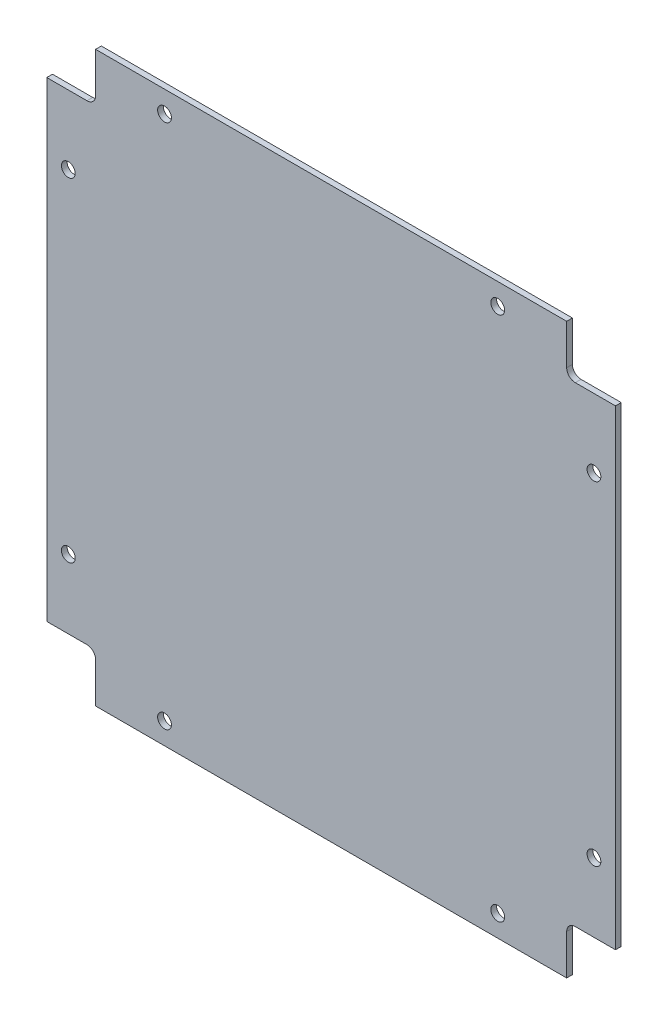
ISO-10303-21;
HEADER;
FILE_DESCRIPTION(('STEP AP214'),'2;1');
FILE_NAME('part.step','',(''),(''),'','','');
FILE_SCHEMA(('AUTOMOTIVE_DESIGN { 1 0 10303 214 1 1 1 1 }'));
ENDSEC;
DATA;
#1=APPLICATION_CONTEXT('core data for automotive mechanical design processes');
#2=APPLICATION_PROTOCOL_DEFINITION('international standard','automotive_design',2000,#1);
#3=PRODUCT_CONTEXT('',#1,'mechanical');
#4=PRODUCT('Part','Part','',(#3));
#5=PRODUCT_RELATED_PRODUCT_CATEGORY('part','',(#4));
#6=PRODUCT_DEFINITION_FORMATION('','',#4);
#7=PRODUCT_DEFINITION_CONTEXT('part definition',#1,'design');
#8=PRODUCT_DEFINITION('design','',#6,#7);
#9=PRODUCT_DEFINITION_SHAPE('','',#8);
#10=(LENGTH_UNIT() NAMED_UNIT(*) SI_UNIT(.MILLI.,.METRE.));
#11=(NAMED_UNIT(*) PLANE_ANGLE_UNIT() SI_UNIT($,.RADIAN.));
#12=(NAMED_UNIT(*) SI_UNIT($,.STERADIAN.) SOLID_ANGLE_UNIT());
#13=UNCERTAINTY_MEASURE_WITH_UNIT(LENGTH_MEASURE(1.E-05),#10,'distance_accuracy_value','');
#14=(GEOMETRIC_REPRESENTATION_CONTEXT(3) GLOBAL_UNCERTAINTY_ASSIGNED_CONTEXT((#13)) GLOBAL_UNIT_ASSIGNED_CONTEXT((#10,
#11,#12)) REPRESENTATION_CONTEXT('',''));
#15=CARTESIAN_POINT('',(0.,0.,0.));
#16=DIRECTION('',(0.,0.,1.));
#17=DIRECTION('',(1.,0.,0.));
#18=AXIS2_PLACEMENT_3D('',#15,#16,#17);
#19=CARTESIAN_POINT('',(49.5,-49.5,0.5));
#20=DIRECTION('',(-1.,0.,0.));
#21=DIRECTION('',(0.,0.,1.));
#22=AXIS2_PLACEMENT_3D('',#19,#20,#21);
#23=PLANE('',#22);
#24=DIRECTION('',(0.,1.,0.));
#25=VECTOR('',#24,1.);
#26=CARTESIAN_POINT('',(49.5,-49.5,0.5));
#27=LINE('',#26,#25);
#28=CARTESIAN_POINT('',(49.5,-41.,0.5));
#29=VERTEX_POINT('',#28);
#30=CARTESIAN_POINT('',(49.5,41.,0.5));
#31=VERTEX_POINT('',#30);
#32=EDGE_CURVE('E165',#29,#31,#27,.T.);
#33=ORIENTED_EDGE('',*,*,#32,.F.);
#34=DIRECTION('',(0.,0.,1.));
#35=VECTOR('',#34,1.);
#36=CARTESIAN_POINT('',(49.5,-41.,-0.5));
#37=LINE('',#36,#35);
#38=CARTESIAN_POINT('',(49.5,-41.,-0.5));
#39=VERTEX_POINT('',#38);
#40=EDGE_CURVE('E256',#39,#29,#37,.T.);
#41=ORIENTED_EDGE('',*,*,#40,.F.);
#42=DIRECTION('',(0.,1.,0.));
#43=VECTOR('',#42,1.);
#44=CARTESIAN_POINT('',(49.5,-49.5,-0.5));
#45=LINE('',#44,#43);
#46=CARTESIAN_POINT('',(49.5,41.,-0.5));
#47=VERTEX_POINT('',#46);
#48=EDGE_CURVE('E309',#39,#47,#45,.T.);
#49=ORIENTED_EDGE('',*,*,#48,.T.);
#50=DIRECTION('',(0.,0.,1.));
#51=VECTOR('',#50,1.);
#52=CARTESIAN_POINT('',(49.5,41.,-0.5));
#53=LINE('',#52,#51);
#54=EDGE_CURVE('E284',#47,#31,#53,.T.);
#55=ORIENTED_EDGE('',*,*,#54,.T.);
#56=EDGE_LOOP('',(#33,#41,#49,#55));
#57=FACE_BOUND('',#56,.T.);
#58=ADVANCED_FACE('F32',(#57),#23,.F.);
#59=CARTESIAN_POINT('',(-49.5,49.5,0.5));
#60=DIRECTION('',(0.,-1.,0.));
#61=DIRECTION('',(0.,0.,-1.));
#62=AXIS2_PLACEMENT_3D('',#59,#60,#61);
#63=PLANE('',#62);
#64=DIRECTION('',(-1.,0.,0.));
#65=VECTOR('',#64,1.);
#66=CARTESIAN_POINT('',(-49.5,49.5,0.5));
#67=LINE('',#66,#65);
#68=CARTESIAN_POINT('',(41.,49.5,0.5));
#69=VERTEX_POINT('',#68);
#70=CARTESIAN_POINT('',(-41.,49.5,0.5));
#71=VERTEX_POINT('',#70);
#72=EDGE_CURVE('E168',#69,#71,#67,.T.);
#73=ORIENTED_EDGE('',*,*,#72,.F.);
#74=DIRECTION('',(0.,0.,1.));
#75=VECTOR('',#74,1.);
#76=CARTESIAN_POINT('',(41.,49.5,-0.5));
#77=LINE('',#76,#75);
#78=CARTESIAN_POINT('',(41.,49.5,-0.5));
#79=VERTEX_POINT('',#78);
#80=EDGE_CURVE('E282',#79,#69,#77,.T.);
#81=ORIENTED_EDGE('',*,*,#80,.F.);
#82=DIRECTION('',(-1.,0.,0.));
#83=VECTOR('',#82,1.);
#84=CARTESIAN_POINT('',(-49.5,49.5,-0.5));
#85=LINE('',#84,#83);
#86=CARTESIAN_POINT('',(-41.,49.5,-0.5));
#87=VERTEX_POINT('',#86);
#88=EDGE_CURVE('E171',#79,#87,#85,.T.);
#89=ORIENTED_EDGE('',*,*,#88,.T.);
#90=DIRECTION('',(0.,0.,1.));
#91=VECTOR('',#90,1.);
#92=CARTESIAN_POINT('',(-41.,49.5,-0.5));
#93=LINE('',#92,#91);
#94=EDGE_CURVE('E306',#87,#71,#93,.T.);
#95=ORIENTED_EDGE('',*,*,#94,.T.);
#96=EDGE_LOOP('',(#73,#81,#89,#95));
#97=FACE_BOUND('',#96,.T.);
#98=ADVANCED_FACE('F323',(#97),#63,.F.);
#99=CARTESIAN_POINT('',(-49.5,-49.5,0.5));
#100=DIRECTION('',(1.,0.,0.));
#101=DIRECTION('',(0.,0.,-1.));
#102=AXIS2_PLACEMENT_3D('',#99,#100,#101);
#103=PLANE('',#102);
#104=DIRECTION('',(0.,-1.,0.));
#105=VECTOR('',#104,1.);
#106=CARTESIAN_POINT('',(-49.5,-49.5,-0.5));
#107=LINE('',#106,#105);
#108=CARTESIAN_POINT('',(-49.5,41.,-0.5));
#109=VERTEX_POINT('',#108);
#110=CARTESIAN_POINT('',(-49.5,-41.,-0.5));
#111=VERTEX_POINT('',#110);
#112=EDGE_CURVE('E166',#109,#111,#107,.T.);
#113=ORIENTED_EDGE('',*,*,#112,.T.);
#114=DIRECTION('',(0.,0.,1.));
#115=VECTOR('',#114,1.);
#116=CARTESIAN_POINT('',(-49.5,-41.,-0.5));
#117=LINE('',#116,#115);
#118=CARTESIAN_POINT('',(-49.5,-41.,0.5));
#119=VERTEX_POINT('',#118);
#120=EDGE_CURVE('E231',#111,#119,#117,.T.);
#121=ORIENTED_EDGE('',*,*,#120,.T.);
#122=DIRECTION('',(0.,-1.,0.));
#123=VECTOR('',#122,1.);
#124=CARTESIAN_POINT('',(-49.5,-49.5,0.5));
#125=LINE('',#124,#123);
#126=CARTESIAN_POINT('',(-49.5,41.,0.5));
#127=VERTEX_POINT('',#126);
#128=EDGE_CURVE('E40',#127,#119,#125,.T.);
#129=ORIENTED_EDGE('',*,*,#128,.F.);
#130=DIRECTION('',(0.,0.,1.));
#131=VECTOR('',#130,1.);
#132=CARTESIAN_POINT('',(-49.5,41.,-0.5));
#133=LINE('',#132,#131);
#134=EDGE_CURVE('E298',#109,#127,#133,.T.);
#135=ORIENTED_EDGE('',*,*,#134,.F.);
#136=EDGE_LOOP('',(#113,#121,#129,#135));
#137=FACE_BOUND('',#136,.T.);
#138=ADVANCED_FACE('F373',(#137),#103,.F.);
#139=CARTESIAN_POINT('',(-49.5,-49.5,0.5));
#140=DIRECTION('',(0.,1.,0.));
#141=DIRECTION('',(0.,0.,1.));
#142=AXIS2_PLACEMENT_3D('',#139,#140,#141);
#143=PLANE('',#142);
#144=DIRECTION('',(1.,0.,0.));
#145=VECTOR('',#144,1.);
#146=CARTESIAN_POINT('',(-49.5,-49.5,0.5));
#147=LINE('',#146,#145);
#148=CARTESIAN_POINT('',(-41.,-49.5,0.5));
#149=VERTEX_POINT('',#148);
#150=CARTESIAN_POINT('',(41.,-49.5,0.5));
#151=VERTEX_POINT('',#150);
#152=EDGE_CURVE('E11',#149,#151,#147,.T.);
#153=ORIENTED_EDGE('',*,*,#152,.F.);
#154=DIRECTION('',(0.,0.,1.));
#155=VECTOR('',#154,1.);
#156=CARTESIAN_POINT('',(-41.,-49.5,-0.5));
#157=LINE('',#156,#155);
#158=CARTESIAN_POINT('',(-41.,-49.5,-0.5));
#159=VERTEX_POINT('',#158);
#160=EDGE_CURVE('E149',#159,#149,#157,.T.);
#161=ORIENTED_EDGE('',*,*,#160,.F.);
#162=DIRECTION('',(1.,0.,0.));
#163=VECTOR('',#162,1.);
#164=CARTESIAN_POINT('',(-49.5,-49.5,-0.5));
#165=LINE('',#164,#163);
#166=CARTESIAN_POINT('',(41.,-49.5,-0.5));
#167=VERTEX_POINT('',#166);
#168=EDGE_CURVE('E56',#159,#167,#165,.T.);
#169=ORIENTED_EDGE('',*,*,#168,.T.);
#170=DIRECTION('',(0.,0.,1.));
#171=VECTOR('',#170,1.);
#172=CARTESIAN_POINT('',(41.,-49.5,-0.5));
#173=LINE('',#172,#171);
#174=EDGE_CURVE('E258',#167,#151,#173,.T.);
#175=ORIENTED_EDGE('',*,*,#174,.T.);
#176=EDGE_LOOP('',(#153,#161,#169,#175));
#177=FACE_BOUND('',#176,.T.);
#178=ADVANCED_FACE('F156',(#177),#143,.F.);
#179=CARTESIAN_POINT('',(0.,0.,0.5));
#180=DIRECTION('',(0.,0.,-1.));
#181=DIRECTION('',(-1.,0.,0.));
#182=AXIS2_PLACEMENT_3D('',#179,#180,#181);
#183=PLANE('',#182);
#184=CARTESIAN_POINT('',(-45.75,29.,0.5));
#185=DIRECTION('',(0.,0.,1.));
#186=DIRECTION('',(1.,0.,0.));
#187=AXIS2_PLACEMENT_3D('',#184,#185,#186);
#188=CIRCLE('',#187,1.2);
#189=CARTESIAN_POINT('',(-44.55,29.,0.5));
#190=VERTEX_POINT('',#189);
#191=EDGE_CURVE('E211',#190,#190,#188,.T.);
#192=ORIENTED_EDGE('',*,*,#191,.F.);
#193=EDGE_LOOP('',(#192));
#194=FACE_BOUND('',#193,.T.);
#195=CARTESIAN_POINT('',(-29.,45.75,0.5));
#196=DIRECTION('',(0.,0.,1.));
#197=DIRECTION('',(1.,0.,0.));
#198=AXIS2_PLACEMENT_3D('',#195,#196,#197);
#199=CIRCLE('',#198,1.2);
#200=CARTESIAN_POINT('',(-27.8,45.75,0.5));
#201=VERTEX_POINT('',#200);
#202=EDGE_CURVE('E201',#201,#201,#199,.T.);
#203=ORIENTED_EDGE('',*,*,#202,.F.);
#204=EDGE_LOOP('',(#203));
#205=FACE_BOUND('',#204,.T.);
#206=CARTESIAN_POINT('',(29.,45.75,0.5));
#207=DIRECTION('',(0.,0.,1.));
#208=DIRECTION('',(1.,0.,0.));
#209=AXIS2_PLACEMENT_3D('',#206,#207,#208);
#210=CIRCLE('',#209,1.2);
#211=CARTESIAN_POINT('',(30.2,45.75,0.5));
#212=VERTEX_POINT('',#211);
#213=EDGE_CURVE('E198',#212,#212,#210,.T.);
#214=ORIENTED_EDGE('',*,*,#213,.F.);
#215=EDGE_LOOP('',(#214));
#216=FACE_BOUND('',#215,.T.);
#217=CARTESIAN_POINT('',(45.75,29.,0.5));
#218=DIRECTION('',(0.,0.,1.));
#219=DIRECTION('',(1.,0.,0.));
#220=AXIS2_PLACEMENT_3D('',#217,#218,#219);
#221=CIRCLE('',#220,1.2);
#222=CARTESIAN_POINT('',(46.95,29.,0.5));
#223=VERTEX_POINT('',#222);
#224=EDGE_CURVE('E195',#223,#223,#221,.T.);
#225=ORIENTED_EDGE('',*,*,#224,.F.);
#226=EDGE_LOOP('',(#225));
#227=FACE_BOUND('',#226,.T.);
#228=CARTESIAN_POINT('',(45.75,-29.,0.5));
#229=DIRECTION('',(0.,0.,1.));
#230=DIRECTION('',(1.,0.,0.));
#231=AXIS2_PLACEMENT_3D('',#228,#229,#230);
#232=CIRCLE('',#231,1.2);
#233=CARTESIAN_POINT('',(46.95,-29.,0.5));
#234=VERTEX_POINT('',#233);
#235=EDGE_CURVE('E191',#234,#234,#232,.T.);
#236=ORIENTED_EDGE('',*,*,#235,.F.);
#237=EDGE_LOOP('',(#236));
#238=FACE_BOUND('',#237,.T.);
#239=CARTESIAN_POINT('',(29.,-45.75,0.5));
#240=DIRECTION('',(0.,0.,1.));
#241=DIRECTION('',(1.,0.,0.));
#242=AXIS2_PLACEMENT_3D('',#239,#240,#241);
#243=CIRCLE('',#242,1.2);
#244=CARTESIAN_POINT('',(30.2,-45.75,0.5));
#245=VERTEX_POINT('',#244);
#246=EDGE_CURVE('E187',#245,#245,#243,.T.);
#247=ORIENTED_EDGE('',*,*,#246,.F.);
#248=EDGE_LOOP('',(#247));
#249=FACE_BOUND('',#248,.T.);
#250=CARTESIAN_POINT('',(-29.,-45.75,0.5));
#251=DIRECTION('',(0.,0.,1.));
#252=DIRECTION('',(1.,0.,0.));
#253=AXIS2_PLACEMENT_3D('',#250,#251,#252);
#254=CIRCLE('',#253,1.2);
#255=CARTESIAN_POINT('',(-27.8,-45.75,0.5));
#256=VERTEX_POINT('',#255);
#257=EDGE_CURVE('E183',#256,#256,#254,.T.);
#258=ORIENTED_EDGE('',*,*,#257,.F.);
#259=EDGE_LOOP('',(#258));
#260=FACE_BOUND('',#259,.T.);
#261=CARTESIAN_POINT('',(-45.75,-29.,0.5));
#262=DIRECTION('',(0.,0.,1.));
#263=DIRECTION('',(1.,0.,0.));
#264=AXIS2_PLACEMENT_3D('',#261,#262,#263);
#265=CIRCLE('',#264,1.2);
#266=CARTESIAN_POINT('',(-44.55,-29.,0.5));
#267=VERTEX_POINT('',#266);
#268=EDGE_CURVE('E179',#267,#267,#265,.T.);
#269=ORIENTED_EDGE('',*,*,#268,.F.);
#270=EDGE_LOOP('',(#269));
#271=FACE_BOUND('',#270,.T.);
#272=ORIENTED_EDGE('',*,*,#128,.T.);
#273=DIRECTION('',(-1.,0.,0.));
#274=VECTOR('',#273,1.);
#275=CARTESIAN_POINT('',(-49.5,-41.,0.5));
#276=LINE('',#275,#274);
#277=CARTESIAN_POINT('',(-42.5,-41.,0.5));
#278=VERTEX_POINT('',#277);
#279=EDGE_CURVE('E153',#278,#119,#276,.T.);
#280=ORIENTED_EDGE('',*,*,#279,.F.);
#281=CARTESIAN_POINT('',(-42.5,-42.5,0.5));
#282=DIRECTION('',(0.,0.,1.));
#283=DIRECTION('',(-1.,0.,0.));
#284=AXIS2_PLACEMENT_3D('',#281,#282,#283);
#285=CIRCLE('',#284,1.5);
#286=CARTESIAN_POINT('',(-41.,-42.5,0.5));
#287=VERTEX_POINT('',#286);
#288=EDGE_CURVE('E227',#287,#278,#285,.T.);
#289=ORIENTED_EDGE('',*,*,#288,.F.);
#290=DIRECTION('',(0.,1.,0.));
#291=VECTOR('',#290,1.);
#292=CARTESIAN_POINT('',(-41.,-49.5,0.5));
#293=LINE('',#292,#291);
#294=EDGE_CURVE('E178',#149,#287,#293,.T.);
#295=ORIENTED_EDGE('',*,*,#294,.F.);
#296=ORIENTED_EDGE('',*,*,#152,.T.);
#297=DIRECTION('',(0.,-1.,0.));
#298=VECTOR('',#297,1.);
#299=CARTESIAN_POINT('',(41.,-49.5,0.5));
#300=LINE('',#299,#298);
#301=CARTESIAN_POINT('',(41.,-42.5,0.5));
#302=VERTEX_POINT('',#301);
#303=EDGE_CURVE('E248',#302,#151,#300,.T.);
#304=ORIENTED_EDGE('',*,*,#303,.F.);
#305=CARTESIAN_POINT('',(42.5,-42.5,0.5));
#306=DIRECTION('',(0.,0.,1.));
#307=DIRECTION('',(1.,0.,0.));
#308=AXIS2_PLACEMENT_3D('',#305,#306,#307);
#309=CIRCLE('',#308,1.5);
#310=CARTESIAN_POINT('',(42.5,-41.,0.5));
#311=VERTEX_POINT('',#310);
#312=EDGE_CURVE('E234',#311,#302,#309,.T.);
#313=ORIENTED_EDGE('',*,*,#312,.F.);
#314=DIRECTION('',(-1.,0.,0.));
#315=VECTOR('',#314,1.);
#316=CARTESIAN_POINT('',(49.5,-41.,0.5));
#317=LINE('',#316,#315);
#318=EDGE_CURVE('E240',#29,#311,#317,.T.);
#319=ORIENTED_EDGE('',*,*,#318,.F.);
#320=ORIENTED_EDGE('',*,*,#32,.T.);
#321=DIRECTION('',(1.,0.,0.));
#322=VECTOR('',#321,1.);
#323=CARTESIAN_POINT('',(49.5,41.,0.5));
#324=LINE('',#323,#322);
#325=CARTESIAN_POINT('',(42.5,41.,0.5));
#326=VERTEX_POINT('',#325);
#327=EDGE_CURVE('E274',#326,#31,#324,.T.);
#328=ORIENTED_EDGE('',*,*,#327,.F.);
#329=CARTESIAN_POINT('',(42.5,42.5,0.5));
#330=DIRECTION('',(0.,0.,1.));
#331=DIRECTION('',(1.,0.,0.));
#332=AXIS2_PLACEMENT_3D('',#329,#330,#331);
#333=CIRCLE('',#332,1.5);
#334=CARTESIAN_POINT('',(41.,42.5,0.5));
#335=VERTEX_POINT('',#334);
#336=EDGE_CURVE('E255',#335,#326,#333,.T.);
#337=ORIENTED_EDGE('',*,*,#336,.F.);
#338=DIRECTION('',(0.,-1.,0.));
#339=VECTOR('',#338,1.);
#340=CARTESIAN_POINT('',(41.,49.5,0.5));
#341=LINE('',#340,#339);
#342=EDGE_CURVE('E265',#69,#335,#341,.T.);
#343=ORIENTED_EDGE('',*,*,#342,.F.);
#344=ORIENTED_EDGE('',*,*,#72,.T.);
#345=DIRECTION('',(0.,1.,0.));
#346=VECTOR('',#345,1.);
#347=CARTESIAN_POINT('',(-41.,49.5,0.5));
#348=LINE('',#347,#346);
#349=CARTESIAN_POINT('',(-41.,42.5,0.5));
#350=VERTEX_POINT('',#349);
#351=EDGE_CURVE('E292',#350,#71,#348,.T.);
#352=ORIENTED_EDGE('',*,*,#351,.F.);
#353=CARTESIAN_POINT('',(-42.5,42.5,0.5));
#354=DIRECTION('',(0.,0.,1.));
#355=DIRECTION('',(-1.,0.,0.));
#356=AXIS2_PLACEMENT_3D('',#353,#354,#355);
#357=CIRCLE('',#356,1.5);
#358=CARTESIAN_POINT('',(-42.5,41.,0.5));
#359=VERTEX_POINT('',#358);
#360=EDGE_CURVE('E301',#359,#350,#357,.T.);
#361=ORIENTED_EDGE('',*,*,#360,.F.);
#362=DIRECTION('',(1.,0.,0.));
#363=VECTOR('',#362,1.);
#364=CARTESIAN_POINT('',(-49.5,41.,0.5));
#365=LINE('',#364,#363);
#366=EDGE_CURVE('E281',#127,#359,#365,.T.);
#367=ORIENTED_EDGE('',*,*,#366,.F.);
#368=EDGE_LOOP('',(#272,#280,#289,#295,#296,#304,#313,#319,#320,#328,#337,#343,#344,#352,#361,#367));
#369=FACE_BOUND('',#368,.T.);
#370=ADVANCED_FACE('F339',(#194,#205,#216,#227,#238,#249,#260,#271,#369),#183,.F.);
#371=CARTESIAN_POINT('',(0.,0.,-0.5));
#372=DIRECTION('',(0.,0.,-1.));
#373=DIRECTION('',(-1.,0.,0.));
#374=AXIS2_PLACEMENT_3D('',#371,#372,#373);
#375=PLANE('',#374);
#376=CARTESIAN_POINT('',(-45.75,29.,-0.5));
#377=DIRECTION('',(0.,0.,-1.));
#378=DIRECTION('',(-1.,0.,0.));
#379=AXIS2_PLACEMENT_3D('',#376,#377,#378);
#380=CIRCLE('',#379,1.2);
#381=CARTESIAN_POINT('',(-46.95,29.,-0.5));
#382=VERTEX_POINT('',#381);
#383=EDGE_CURVE('E35',#382,#382,#380,.T.);
#384=ORIENTED_EDGE('',*,*,#383,.F.);
#385=EDGE_LOOP('',(#384));
#386=FACE_BOUND('',#385,.T.);
#387=CARTESIAN_POINT('',(-29.,45.75,-0.5));
#388=DIRECTION('',(0.,0.,-1.));
#389=DIRECTION('',(-1.,0.,0.));
#390=AXIS2_PLACEMENT_3D('',#387,#388,#389);
#391=CIRCLE('',#390,1.2);
#392=CARTESIAN_POINT('',(-30.2,45.75,-0.5));
#393=VERTEX_POINT('',#392);
#394=EDGE_CURVE('E199',#393,#393,#391,.T.);
#395=ORIENTED_EDGE('',*,*,#394,.F.);
#396=EDGE_LOOP('',(#395));
#397=FACE_BOUND('',#396,.T.);
#398=CARTESIAN_POINT('',(29.,45.75,-0.5));
#399=DIRECTION('',(0.,0.,-1.));
#400=DIRECTION('',(-1.,0.,0.));
#401=AXIS2_PLACEMENT_3D('',#398,#399,#400);
#402=CIRCLE('',#401,1.2);
#403=CARTESIAN_POINT('',(27.8,45.75,-0.5));
#404=VERTEX_POINT('',#403);
#405=EDGE_CURVE('E196',#404,#404,#402,.T.);
#406=ORIENTED_EDGE('',*,*,#405,.F.);
#407=EDGE_LOOP('',(#406));
#408=FACE_BOUND('',#407,.T.);
#409=CARTESIAN_POINT('',(45.75,29.,-0.5));
#410=DIRECTION('',(0.,0.,-1.));
#411=DIRECTION('',(-1.,0.,0.));
#412=AXIS2_PLACEMENT_3D('',#409,#410,#411);
#413=CIRCLE('',#412,1.2);
#414=CARTESIAN_POINT('',(44.55,29.,-0.5));
#415=VERTEX_POINT('',#414);
#416=EDGE_CURVE('E192',#415,#415,#413,.T.);
#417=ORIENTED_EDGE('',*,*,#416,.F.);
#418=EDGE_LOOP('',(#417));
#419=FACE_BOUND('',#418,.T.);
#420=CARTESIAN_POINT('',(45.75,-29.,-0.5));
#421=DIRECTION('',(0.,0.,-1.));
#422=DIRECTION('',(-1.,0.,0.));
#423=AXIS2_PLACEMENT_3D('',#420,#421,#422);
#424=CIRCLE('',#423,1.2);
#425=CARTESIAN_POINT('',(44.55,-29.,-0.5));
#426=VERTEX_POINT('',#425);
#427=EDGE_CURVE('E188',#426,#426,#424,.T.);
#428=ORIENTED_EDGE('',*,*,#427,.F.);
#429=EDGE_LOOP('',(#428));
#430=FACE_BOUND('',#429,.T.);
#431=CARTESIAN_POINT('',(29.,-45.75,-0.5));
#432=DIRECTION('',(0.,0.,-1.));
#433=DIRECTION('',(-1.,0.,0.));
#434=AXIS2_PLACEMENT_3D('',#431,#432,#433);
#435=CIRCLE('',#434,1.2);
#436=CARTESIAN_POINT('',(27.8,-45.75,-0.5));
#437=VERTEX_POINT('',#436);
#438=EDGE_CURVE('E184',#437,#437,#435,.T.);
#439=ORIENTED_EDGE('',*,*,#438,.F.);
#440=EDGE_LOOP('',(#439));
#441=FACE_BOUND('',#440,.T.);
#442=CARTESIAN_POINT('',(-29.,-45.75,-0.5));
#443=DIRECTION('',(0.,0.,-1.));
#444=DIRECTION('',(-1.,0.,0.));
#445=AXIS2_PLACEMENT_3D('',#442,#443,#444);
#446=CIRCLE('',#445,1.2);
#447=CARTESIAN_POINT('',(-30.2,-45.75,-0.5));
#448=VERTEX_POINT('',#447);
#449=EDGE_CURVE('E180',#448,#448,#446,.T.);
#450=ORIENTED_EDGE('',*,*,#449,.F.);
#451=EDGE_LOOP('',(#450));
#452=FACE_BOUND('',#451,.T.);
#453=CARTESIAN_POINT('',(-45.75,-29.,-0.5));
#454=DIRECTION('',(0.,0.,-1.));
#455=DIRECTION('',(-1.,0.,0.));
#456=AXIS2_PLACEMENT_3D('',#453,#454,#455);
#457=CIRCLE('',#456,1.2);
#458=CARTESIAN_POINT('',(-46.95,-29.,-0.5));
#459=VERTEX_POINT('',#458);
#460=EDGE_CURVE('E175',#459,#459,#457,.T.);
#461=ORIENTED_EDGE('',*,*,#460,.F.);
#462=EDGE_LOOP('',(#461));
#463=FACE_BOUND('',#462,.T.);
#464=DIRECTION('',(-1.,0.,0.));
#465=VECTOR('',#464,1.);
#466=CARTESIAN_POINT('',(-49.5,-41.,-0.5));
#467=LINE('',#466,#465);
#468=CARTESIAN_POINT('',(-42.5,-41.,-0.5));
#469=VERTEX_POINT('',#468);
#470=EDGE_CURVE('E157',#469,#111,#467,.T.);
#471=ORIENTED_EDGE('',*,*,#470,.T.);
#472=ORIENTED_EDGE('',*,*,#112,.F.);
#473=DIRECTION('',(1.,0.,0.));
#474=VECTOR('',#473,1.);
#475=CARTESIAN_POINT('',(-49.5,41.,-0.5));
#476=LINE('',#475,#474);
#477=CARTESIAN_POINT('',(-42.5,41.,-0.5));
#478=VERTEX_POINT('',#477);
#479=EDGE_CURVE('E288',#109,#478,#476,.T.);
#480=ORIENTED_EDGE('',*,*,#479,.T.);
#481=CARTESIAN_POINT('',(-42.5,42.5,-0.5));
#482=DIRECTION('',(0.,0.,1.));
#483=DIRECTION('',(-1.,0.,0.));
#484=AXIS2_PLACEMENT_3D('',#481,#482,#483);
#485=CIRCLE('',#484,1.5);
#486=CARTESIAN_POINT('',(-41.,42.5,-0.5));
#487=VERTEX_POINT('',#486);
#488=EDGE_CURVE('E291',#478,#487,#485,.T.);
#489=ORIENTED_EDGE('',*,*,#488,.T.);
#490=DIRECTION('',(0.,1.,0.));
#491=VECTOR('',#490,1.);
#492=CARTESIAN_POINT('',(-41.,49.5,-0.5));
#493=LINE('',#492,#491);
#494=EDGE_CURVE('E295',#487,#87,#493,.T.);
#495=ORIENTED_EDGE('',*,*,#494,.T.);
#496=ORIENTED_EDGE('',*,*,#88,.F.);
#497=DIRECTION('',(0.,-1.,0.));
#498=VECTOR('',#497,1.);
#499=CARTESIAN_POINT('',(41.,49.5,-0.5));
#500=LINE('',#499,#498);
#501=CARTESIAN_POINT('',(41.,42.5,-0.5));
#502=VERTEX_POINT('',#501);
#503=EDGE_CURVE('E268',#79,#502,#500,.T.);
#504=ORIENTED_EDGE('',*,*,#503,.T.);
#505=CARTESIAN_POINT('',(42.5,42.5,-0.5));
#506=DIRECTION('',(0.,0.,1.));
#507=DIRECTION('',(1.,0.,0.));
#508=AXIS2_PLACEMENT_3D('',#505,#506,#507);
#509=CIRCLE('',#508,1.5);
#510=CARTESIAN_POINT('',(42.5,41.,-0.5));
#511=VERTEX_POINT('',#510);
#512=EDGE_CURVE('E261',#502,#511,#509,.T.);
#513=ORIENTED_EDGE('',*,*,#512,.T.);
#514=DIRECTION('',(1.,0.,0.));
#515=VECTOR('',#514,1.);
#516=CARTESIAN_POINT('',(49.5,41.,-0.5));
#517=LINE('',#516,#515);
#518=EDGE_CURVE('E264',#511,#47,#517,.T.);
#519=ORIENTED_EDGE('',*,*,#518,.T.);
#520=ORIENTED_EDGE('',*,*,#48,.F.);
#521=DIRECTION('',(-1.,0.,0.));
#522=VECTOR('',#521,1.);
#523=CARTESIAN_POINT('',(49.5,-41.,-0.5));
#524=LINE('',#523,#522);
#525=CARTESIAN_POINT('',(42.5,-41.,-0.5));
#526=VERTEX_POINT('',#525);
#527=EDGE_CURVE('E242',#39,#526,#524,.T.);
#528=ORIENTED_EDGE('',*,*,#527,.T.);
#529=CARTESIAN_POINT('',(42.5,-42.5,-0.5));
#530=DIRECTION('',(0.,0.,1.));
#531=DIRECTION('',(1.,0.,0.));
#532=AXIS2_PLACEMENT_3D('',#529,#530,#531);
#533=CIRCLE('',#532,1.5);
#534=CARTESIAN_POINT('',(41.,-42.5,-0.5));
#535=VERTEX_POINT('',#534);
#536=EDGE_CURVE('E238',#526,#535,#533,.T.);
#537=ORIENTED_EDGE('',*,*,#536,.T.);
#538=DIRECTION('',(0.,-1.,0.));
#539=VECTOR('',#538,1.);
#540=CARTESIAN_POINT('',(41.,-49.5,-0.5));
#541=LINE('',#540,#539);
#542=EDGE_CURVE('E164',#535,#167,#541,.T.);
#543=ORIENTED_EDGE('',*,*,#542,.T.);
#544=ORIENTED_EDGE('',*,*,#168,.F.);
#545=DIRECTION('',(0.,1.,0.));
#546=VECTOR('',#545,1.);
#547=CARTESIAN_POINT('',(-41.,-49.5,-0.5));
#548=LINE('',#547,#546);
#549=CARTESIAN_POINT('',(-41.,-42.5,-0.5));
#550=VERTEX_POINT('',#549);
#551=EDGE_CURVE('E146',#159,#550,#548,.T.);
#552=ORIENTED_EDGE('',*,*,#551,.T.);
#553=CARTESIAN_POINT('',(-42.5,-42.5,-0.5));
#554=DIRECTION('',(0.,0.,1.));
#555=DIRECTION('',(-1.,0.,0.));
#556=AXIS2_PLACEMENT_3D('',#553,#554,#555);
#557=CIRCLE('',#556,1.5);
#558=EDGE_CURVE('E48',#550,#469,#557,.T.);
#559=ORIENTED_EDGE('',*,*,#558,.T.);
#560=EDGE_LOOP('',(#471,#472,#480,#489,#495,#496,#504,#513,#519,#520,#528,#537,#543,#544,#552,#559));
#561=FACE_BOUND('',#560,.T.);
#562=ADVANCED_FACE('F161',(#386,#397,#408,#419,#430,#441,#452,#463,#561),#375,.T.);
#563=CARTESIAN_POINT('',(-41.,49.5,-0.5));
#564=DIRECTION('',(1.,0.,0.));
#565=DIRECTION('',(0.,0.,-1.));
#566=AXIS2_PLACEMENT_3D('',#563,#564,#565);
#567=PLANE('',#566);
#568=ORIENTED_EDGE('',*,*,#351,.T.);
#569=ORIENTED_EDGE('',*,*,#94,.F.);
#570=ORIENTED_EDGE('',*,*,#494,.F.);
#571=DIRECTION('',(0.,0.,1.));
#572=VECTOR('',#571,1.);
#573=CARTESIAN_POINT('',(-41.,42.5,-0.5));
#574=LINE('',#573,#572);
#575=EDGE_CURVE('E310',#487,#350,#574,.T.);
#576=ORIENTED_EDGE('',*,*,#575,.T.);
#577=EDGE_LOOP('',(#568,#569,#570,#576));
#578=FACE_BOUND('',#577,.T.);
#579=ADVANCED_FACE('F326',(#578),#567,.F.);
#580=CARTESIAN_POINT('',(-42.5,42.5,-0.5));
#581=DIRECTION('',(0.,0.,1.));
#582=DIRECTION('',(1.,0.,0.));
#583=AXIS2_PLACEMENT_3D('',#580,#581,#582);
#584=CYLINDRICAL_SURFACE('',#583,1.5);
#585=ORIENTED_EDGE('',*,*,#360,.T.);
#586=ORIENTED_EDGE('',*,*,#575,.F.);
#587=ORIENTED_EDGE('',*,*,#488,.F.);
#588=DIRECTION('',(0.,0.,1.));
#589=VECTOR('',#588,1.);
#590=CARTESIAN_POINT('',(-42.5,41.,-0.5));
#591=LINE('',#590,#589);
#592=EDGE_CURVE('E312',#478,#359,#591,.T.);
#593=ORIENTED_EDGE('',*,*,#592,.T.);
#594=EDGE_LOOP('',(#585,#586,#587,#593));
#595=FACE_BOUND('',#594,.T.);
#596=ADVANCED_FACE('F331',(#595),#584,.F.);
#597=CARTESIAN_POINT('',(-49.5,41.,-0.5));
#598=DIRECTION('',(0.,-1.,0.));
#599=DIRECTION('',(0.,0.,-1.));
#600=AXIS2_PLACEMENT_3D('',#597,#598,#599);
#601=PLANE('',#600);
#602=ORIENTED_EDGE('',*,*,#366,.T.);
#603=ORIENTED_EDGE('',*,*,#592,.F.);
#604=ORIENTED_EDGE('',*,*,#479,.F.);
#605=ORIENTED_EDGE('',*,*,#134,.T.);
#606=EDGE_LOOP('',(#602,#603,#604,#605));
#607=FACE_BOUND('',#606,.T.);
#608=ADVANCED_FACE('F333',(#607),#601,.F.);
#609=CARTESIAN_POINT('',(42.5,42.5,-0.5));
#610=DIRECTION('',(0.,0.,1.));
#611=DIRECTION('',(1.,0.,0.));
#612=AXIS2_PLACEMENT_3D('',#609,#610,#611);
#613=CYLINDRICAL_SURFACE('',#612,1.5);
#614=ORIENTED_EDGE('',*,*,#336,.T.);
#615=DIRECTION('',(0.,0.,1.));
#616=VECTOR('',#615,1.);
#617=CARTESIAN_POINT('',(42.5,41.,-0.5));
#618=LINE('',#617,#616);
#619=EDGE_CURVE('E271',#511,#326,#618,.T.);
#620=ORIENTED_EDGE('',*,*,#619,.F.);
#621=ORIENTED_EDGE('',*,*,#512,.F.);
#622=DIRECTION('',(0.,0.,1.));
#623=VECTOR('',#622,1.);
#624=CARTESIAN_POINT('',(41.,42.5,-0.5));
#625=LINE('',#624,#623);
#626=EDGE_CURVE('E279',#502,#335,#625,.T.);
#627=ORIENTED_EDGE('',*,*,#626,.T.);
#628=EDGE_LOOP('',(#614,#620,#621,#627));
#629=FACE_BOUND('',#628,.T.);
#630=ADVANCED_FACE('F349',(#629),#613,.F.);
#631=CARTESIAN_POINT('',(41.,49.5,-0.5));
#632=DIRECTION('',(-1.,0.,0.));
#633=DIRECTION('',(0.,0.,1.));
#634=AXIS2_PLACEMENT_3D('',#631,#632,#633);
#635=PLANE('',#634);
#636=ORIENTED_EDGE('',*,*,#342,.T.);
#637=ORIENTED_EDGE('',*,*,#626,.F.);
#638=ORIENTED_EDGE('',*,*,#503,.F.);
#639=ORIENTED_EDGE('',*,*,#80,.T.);
#640=EDGE_LOOP('',(#636,#637,#638,#639));
#641=FACE_BOUND('',#640,.T.);
#642=ADVANCED_FACE('F344',(#641),#635,.F.);
#643=CARTESIAN_POINT('',(49.5,41.,-0.5));
#644=DIRECTION('',(0.,-1.,0.));
#645=DIRECTION('',(0.,0.,-1.));
#646=AXIS2_PLACEMENT_3D('',#643,#644,#645);
#647=PLANE('',#646);
#648=ORIENTED_EDGE('',*,*,#327,.T.);
#649=ORIENTED_EDGE('',*,*,#54,.F.);
#650=ORIENTED_EDGE('',*,*,#518,.F.);
#651=ORIENTED_EDGE('',*,*,#619,.T.);
#652=EDGE_LOOP('',(#648,#649,#650,#651));
#653=FACE_BOUND('',#652,.T.);
#654=ADVANCED_FACE('F352',(#653),#647,.F.);
#655=CARTESIAN_POINT('',(42.5,-42.5,-0.5));
#656=DIRECTION('',(0.,0.,1.));
#657=DIRECTION('',(1.,0.,0.));
#658=AXIS2_PLACEMENT_3D('',#655,#656,#657);
#659=CYLINDRICAL_SURFACE('',#658,1.5);
#660=ORIENTED_EDGE('',*,*,#312,.T.);
#661=DIRECTION('',(0.,0.,1.));
#662=VECTOR('',#661,1.);
#663=CARTESIAN_POINT('',(41.,-42.5,-0.5));
#664=LINE('',#663,#662);
#665=EDGE_CURVE('E245',#535,#302,#664,.T.);
#666=ORIENTED_EDGE('',*,*,#665,.F.);
#667=ORIENTED_EDGE('',*,*,#536,.F.);
#668=DIRECTION('',(0.,0.,1.));
#669=VECTOR('',#668,1.);
#670=CARTESIAN_POINT('',(42.5,-41.,-0.5));
#671=LINE('',#670,#669);
#672=EDGE_CURVE('E253',#526,#311,#671,.T.);
#673=ORIENTED_EDGE('',*,*,#672,.T.);
#674=EDGE_LOOP('',(#660,#666,#667,#673));
#675=FACE_BOUND('',#674,.T.);
#676=ADVANCED_FACE('F362',(#675),#659,.F.);
#677=CARTESIAN_POINT('',(49.5,-41.,-0.5));
#678=DIRECTION('',(0.,1.,0.));
#679=DIRECTION('',(0.,0.,1.));
#680=AXIS2_PLACEMENT_3D('',#677,#678,#679);
#681=PLANE('',#680);
#682=ORIENTED_EDGE('',*,*,#318,.T.);
#683=ORIENTED_EDGE('',*,*,#672,.F.);
#684=ORIENTED_EDGE('',*,*,#527,.F.);
#685=ORIENTED_EDGE('',*,*,#40,.T.);
#686=EDGE_LOOP('',(#682,#683,#684,#685));
#687=FACE_BOUND('',#686,.T.);
#688=ADVANCED_FACE('F358',(#687),#681,.F.);
#689=CARTESIAN_POINT('',(41.,-49.5,-0.5));
#690=DIRECTION('',(-1.,0.,0.));
#691=DIRECTION('',(0.,0.,1.));
#692=AXIS2_PLACEMENT_3D('',#689,#690,#691);
#693=PLANE('',#692);
#694=ORIENTED_EDGE('',*,*,#303,.T.);
#695=ORIENTED_EDGE('',*,*,#174,.F.);
#696=ORIENTED_EDGE('',*,*,#542,.F.);
#697=ORIENTED_EDGE('',*,*,#665,.T.);
#698=EDGE_LOOP('',(#694,#695,#696,#697));
#699=FACE_BOUND('',#698,.T.);
#700=ADVANCED_FACE('F365',(#699),#693,.F.);
#701=CARTESIAN_POINT('',(-49.5,-41.,-0.5));
#702=DIRECTION('',(0.,1.,0.));
#703=DIRECTION('',(0.,0.,1.));
#704=AXIS2_PLACEMENT_3D('',#701,#702,#703);
#705=PLANE('',#704);
#706=ORIENTED_EDGE('',*,*,#279,.T.);
#707=ORIENTED_EDGE('',*,*,#120,.F.);
#708=ORIENTED_EDGE('',*,*,#470,.F.);
#709=DIRECTION('',(0.,0.,1.));
#710=VECTOR('',#709,1.);
#711=CARTESIAN_POINT('',(-42.5,-41.,-0.5));
#712=LINE('',#711,#710);
#713=EDGE_CURVE('E235',#469,#278,#712,.T.);
#714=ORIENTED_EDGE('',*,*,#713,.T.);
#715=EDGE_LOOP('',(#706,#707,#708,#714));
#716=FACE_BOUND('',#715,.T.);
#717=ADVANCED_FACE('F371',(#716),#705,.F.);
#718=CARTESIAN_POINT('',(-42.5,-42.5,-0.5));
#719=DIRECTION('',(0.,0.,1.));
#720=DIRECTION('',(1.,0.,0.));
#721=AXIS2_PLACEMENT_3D('',#718,#719,#720);
#722=CYLINDRICAL_SURFACE('',#721,1.5);
#723=ORIENTED_EDGE('',*,*,#288,.T.);
#724=ORIENTED_EDGE('',*,*,#713,.F.);
#725=ORIENTED_EDGE('',*,*,#558,.F.);
#726=DIRECTION('',(0.,0.,1.));
#727=VECTOR('',#726,1.);
#728=CARTESIAN_POINT('',(-41.,-42.5,-0.5));
#729=LINE('',#728,#727);
#730=EDGE_CURVE('E151',#550,#287,#729,.T.);
#731=ORIENTED_EDGE('',*,*,#730,.T.);
#732=EDGE_LOOP('',(#723,#724,#725,#731));
#733=FACE_BOUND('',#732,.T.);
#734=ADVANCED_FACE('F368',(#733),#722,.F.);
#735=CARTESIAN_POINT('',(-41.,-49.5,-0.5));
#736=DIRECTION('',(1.,0.,0.));
#737=DIRECTION('',(0.,0.,-1.));
#738=AXIS2_PLACEMENT_3D('',#735,#736,#737);
#739=PLANE('',#738);
#740=ORIENTED_EDGE('',*,*,#294,.T.);
#741=ORIENTED_EDGE('',*,*,#730,.F.);
#742=ORIENTED_EDGE('',*,*,#551,.F.);
#743=ORIENTED_EDGE('',*,*,#160,.T.);
#744=EDGE_LOOP('',(#740,#741,#742,#743));
#745=FACE_BOUND('',#744,.T.);
#746=ADVANCED_FACE('F148',(#745),#739,.F.);
#747=CARTESIAN_POINT('',(-45.75,-29.,0.5));
#748=DIRECTION('',(0.,0.,1.));
#749=DIRECTION('',(1.,0.,0.));
#750=AXIS2_PLACEMENT_3D('',#747,#748,#749);
#751=CYLINDRICAL_SURFACE('',#750,1.2);
#752=ORIENTED_EDGE('',*,*,#460,.T.);
#753=EDGE_LOOP('',(#752));
#754=FACE_BOUND('',#753,.T.);
#755=ORIENTED_EDGE('',*,*,#268,.T.);
#756=EDGE_LOOP('',(#755));
#757=FACE_BOUND('',#756,.T.);
#758=ADVANCED_FACE('F499',(#754,#757),#751,.F.);
#759=CARTESIAN_POINT('',(-29.,-45.75,0.5));
#760=DIRECTION('',(0.,0.,1.));
#761=DIRECTION('',(1.,0.,0.));
#762=AXIS2_PLACEMENT_3D('',#759,#760,#761);
#763=CYLINDRICAL_SURFACE('',#762,1.2);
#764=ORIENTED_EDGE('',*,*,#449,.T.);
#765=EDGE_LOOP('',(#764));
#766=FACE_BOUND('',#765,.T.);
#767=ORIENTED_EDGE('',*,*,#257,.T.);
#768=EDGE_LOOP('',(#767));
#769=FACE_BOUND('',#768,.T.);
#770=ADVANCED_FACE('F522',(#766,#769),#763,.F.);
#771=CARTESIAN_POINT('',(29.,-45.75,0.5));
#772=DIRECTION('',(0.,0.,1.));
#773=DIRECTION('',(1.,0.,0.));
#774=AXIS2_PLACEMENT_3D('',#771,#772,#773);
#775=CYLINDRICAL_SURFACE('',#774,1.2);
#776=ORIENTED_EDGE('',*,*,#438,.T.);
#777=EDGE_LOOP('',(#776));
#778=FACE_BOUND('',#777,.T.);
#779=ORIENTED_EDGE('',*,*,#246,.T.);
#780=EDGE_LOOP('',(#779));
#781=FACE_BOUND('',#780,.T.);
#782=ADVANCED_FACE('F532',(#778,#781),#775,.F.);
#783=CARTESIAN_POINT('',(45.75,-29.,0.5));
#784=DIRECTION('',(0.,0.,1.));
#785=DIRECTION('',(1.,0.,0.));
#786=AXIS2_PLACEMENT_3D('',#783,#784,#785);
#787=CYLINDRICAL_SURFACE('',#786,1.2);
#788=ORIENTED_EDGE('',*,*,#427,.T.);
#789=EDGE_LOOP('',(#788));
#790=FACE_BOUND('',#789,.T.);
#791=ORIENTED_EDGE('',*,*,#235,.T.);
#792=EDGE_LOOP('',(#791));
#793=FACE_BOUND('',#792,.T.);
#794=ADVANCED_FACE('F542',(#790,#793),#787,.F.);
#795=CARTESIAN_POINT('',(45.75,29.,0.5));
#796=DIRECTION('',(0.,0.,1.));
#797=DIRECTION('',(1.,0.,0.));
#798=AXIS2_PLACEMENT_3D('',#795,#796,#797);
#799=CYLINDRICAL_SURFACE('',#798,1.2);
#800=ORIENTED_EDGE('',*,*,#416,.T.);
#801=EDGE_LOOP('',(#800));
#802=FACE_BOUND('',#801,.T.);
#803=ORIENTED_EDGE('',*,*,#224,.T.);
#804=EDGE_LOOP('',(#803));
#805=FACE_BOUND('',#804,.T.);
#806=ADVANCED_FACE('F552',(#802,#805),#799,.F.);
#807=CARTESIAN_POINT('',(29.,45.75,0.5));
#808=DIRECTION('',(0.,0.,1.));
#809=DIRECTION('',(1.,0.,0.));
#810=AXIS2_PLACEMENT_3D('',#807,#808,#809);
#811=CYLINDRICAL_SURFACE('',#810,1.2);
#812=ORIENTED_EDGE('',*,*,#405,.T.);
#813=EDGE_LOOP('',(#812));
#814=FACE_BOUND('',#813,.T.);
#815=ORIENTED_EDGE('',*,*,#213,.T.);
#816=EDGE_LOOP('',(#815));
#817=FACE_BOUND('',#816,.T.);
#818=ADVANCED_FACE('F562',(#814,#817),#811,.F.);
#819=CARTESIAN_POINT('',(-29.,45.75,0.5));
#820=DIRECTION('',(0.,0.,1.));
#821=DIRECTION('',(1.,0.,0.));
#822=AXIS2_PLACEMENT_3D('',#819,#820,#821);
#823=CYLINDRICAL_SURFACE('',#822,1.2);
#824=ORIENTED_EDGE('',*,*,#394,.T.);
#825=EDGE_LOOP('',(#824));
#826=FACE_BOUND('',#825,.T.);
#827=ORIENTED_EDGE('',*,*,#202,.T.);
#828=EDGE_LOOP('',(#827));
#829=FACE_BOUND('',#828,.T.);
#830=ADVANCED_FACE('F572',(#826,#829),#823,.F.);
#831=CARTESIAN_POINT('',(-45.75,29.,0.5));
#832=DIRECTION('',(0.,0.,1.));
#833=DIRECTION('',(1.,0.,0.));
#834=AXIS2_PLACEMENT_3D('',#831,#832,#833);
#835=CYLINDRICAL_SURFACE('',#834,1.2);
#836=ORIENTED_EDGE('',*,*,#383,.T.);
#837=EDGE_LOOP('',(#836));
#838=FACE_BOUND('',#837,.T.);
#839=ORIENTED_EDGE('',*,*,#191,.T.);
#840=EDGE_LOOP('',(#839));
#841=FACE_BOUND('',#840,.T.);
#842=ADVANCED_FACE('F582',(#838,#841),#835,.F.);
#843=CLOSED_SHELL('',(#58,#98,#138,#178,#370,#562,#579,#596,#608,#630,#642,#654,#676,#688,#700,
#717,#734,#746,#758,#770,#782,#794,#806,#818,#830,#842));
#844=MANIFOLD_SOLID_BREP('B2',#843);
#845=ADVANCED_BREP_SHAPE_REPRESENTATION('',(#18,#844),#14);
#846=SHAPE_DEFINITION_REPRESENTATION(#9,#845);
ENDSEC;
END-ISO-10303-21;
